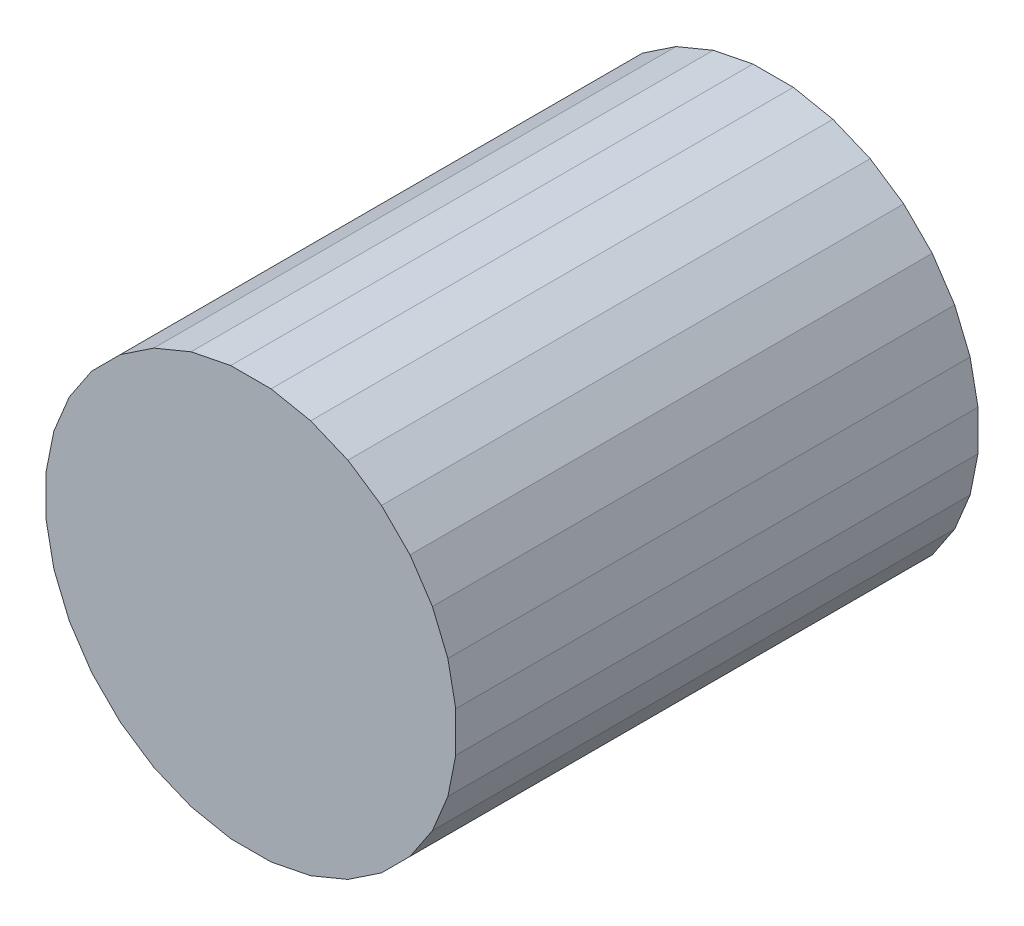
ISO-10303-21;
HEADER;
FILE_DESCRIPTION(('STEP AP214'),'2;1');
FILE_NAME('part.step','',(''),(''),'','','');
FILE_SCHEMA(('AUTOMOTIVE_DESIGN { 1 0 10303 214 1 1 1 1 }'));
ENDSEC;
DATA;
#1=APPLICATION_CONTEXT('core data for automotive mechanical design processes');
#2=APPLICATION_PROTOCOL_DEFINITION('international standard','automotive_design',2000,#1);
#3=PRODUCT_CONTEXT('',#1,'mechanical');
#4=PRODUCT('Part','Part','',(#3));
#5=PRODUCT_RELATED_PRODUCT_CATEGORY('part','',(#4));
#6=PRODUCT_DEFINITION_FORMATION('','',#4);
#7=PRODUCT_DEFINITION_CONTEXT('part definition',#1,'design');
#8=PRODUCT_DEFINITION('design','',#6,#7);
#9=PRODUCT_DEFINITION_SHAPE('','',#8);
#10=(LENGTH_UNIT() NAMED_UNIT(*) SI_UNIT(.MILLI.,.METRE.));
#11=(NAMED_UNIT(*) PLANE_ANGLE_UNIT() SI_UNIT($,.RADIAN.));
#12=(NAMED_UNIT(*) SI_UNIT($,.STERADIAN.) SOLID_ANGLE_UNIT());
#13=UNCERTAINTY_MEASURE_WITH_UNIT(LENGTH_MEASURE(1.E-05),#10,'distance_accuracy_value','');
#14=(GEOMETRIC_REPRESENTATION_CONTEXT(3) GLOBAL_UNCERTAINTY_ASSIGNED_CONTEXT((#13)) GLOBAL_UNIT_ASSIGNED_CONTEXT((#10,
#11,#12)) REPRESENTATION_CONTEXT('',''));
#15=CARTESIAN_POINT('',(0.,0.,0.));
#16=DIRECTION('',(0.,0.,1.));
#17=DIRECTION('',(1.,0.,0.));
#18=AXIS2_PLACEMENT_3D('',#15,#16,#17);
#19=CARTESIAN_POINT('',(-9.570444523572E-07,-9.570444537676E-07,3.94999972));
#20=DIRECTION('',(0.,0.,-1.));
#21=DIRECTION('',(0.,-1.,0.));
#22=AXIS2_PLACEMENT_3D('',#19,#20,#21);
#23=PLANE('',#22);
#24=DIRECTION('',(0.,-1.,0.));
#25=VECTOR('',#24,1.);
#26=CARTESIAN_POINT('',(1.54949144,0.,3.94999972));
#27=LINE('',#26,#25);
#28=CARTESIAN_POINT('',(1.54949144,0.15261082,3.94999972));
#29=VERTEX_POINT('',#28);
#30=CARTESIAN_POINT('',(1.54949144,-0.15261336,3.94999972));
#31=VERTEX_POINT('',#30);
#32=EDGE_CURVE('E540',#29,#31,#27,.T.);
#33=ORIENTED_EDGE('',*,*,#32,.F.);
#34=DIRECTION('',(0.195096606945041,-0.980784030232208,0.));
#35=VECTOR('',#34,1.);
#36=CARTESIAN_POINT('',(1.48994368,0.4519676,3.94999972));
#37=LINE('',#36,#35);
#38=CARTESIAN_POINT('',(1.48994368,0.4519676,3.94999972));
#39=VERTEX_POINT('',#38);
#40=EDGE_CURVE('E176',#39,#29,#37,.T.);
#41=ORIENTED_EDGE('',*,*,#40,.F.);
#42=DIRECTION('',(0.382683505564107,-0.923879502191258,0.));
#43=VECTOR('',#42,1.);
#44=CARTESIAN_POINT('',(1.37313924,0.7339584,3.94999972));
#45=LINE('',#44,#43);
#46=CARTESIAN_POINT('',(1.37313924,0.7339584,3.94999972));
#47=VERTEX_POINT('',#46);
#48=EDGE_CURVE('E179',#47,#39,#45,.T.);
#49=ORIENTED_EDGE('',*,*,#48,.F.);
#50=DIRECTION('',(0.555569838306281,-0.83146987604142,0.));
#51=VECTOR('',#50,1.);
#52=CARTESIAN_POINT('',(1.2035663,0.9877425,3.94999972));
#53=LINE('',#52,#51);
#54=CARTESIAN_POINT('',(1.2035663,0.9877425,3.94999972));
#55=VERTEX_POINT('',#54);
#56=EDGE_CURVE('E286',#55,#47,#53,.T.);
#57=ORIENTED_EDGE('',*,*,#56,.F.);
#58=DIRECTION('',(0.707106781186548,-0.707106781186548,0.));
#59=VECTOR('',#58,1.);
#60=CARTESIAN_POINT('',(0.9877425,1.2035663,3.94999972));
#61=LINE('',#60,#59);
#62=CARTESIAN_POINT('',(0.9877425,1.2035663,3.94999972));
#63=VERTEX_POINT('',#62);
#64=EDGE_CURVE('E424',#63,#55,#61,.T.);
#65=ORIENTED_EDGE('',*,*,#64,.F.);
#66=DIRECTION('',(0.831469876040958,-0.555569838306972,0.));
#67=VECTOR('',#66,1.);
#68=CARTESIAN_POINT('',(0.7339584,1.37313924,3.94999972));
#69=LINE('',#68,#67);
#70=CARTESIAN_POINT('',(0.7339584,1.37313924,3.94999972));
#71=VERTEX_POINT('',#70);
#72=EDGE_CURVE('E204',#71,#63,#69,.T.);
#73=ORIENTED_EDGE('',*,*,#72,.F.);
#74=DIRECTION('',(0.923879502191258,-0.382683505564107,0.));
#75=VECTOR('',#74,1.);
#76=CARTESIAN_POINT('',(0.4519676,1.48994368,3.94999972));
#77=LINE('',#76,#75);
#78=CARTESIAN_POINT('',(0.4519676,1.48994368,3.94999972));
#79=VERTEX_POINT('',#78);
#80=EDGE_CURVE('E189',#79,#71,#77,.T.);
#81=ORIENTED_EDGE('',*,*,#80,.F.);
#82=DIRECTION('',(0.980784030232208,-0.195096606945041,0.));
#83=VECTOR('',#82,1.);
#84=CARTESIAN_POINT('',(0.15261082,1.54949144,3.94999972));
#85=LINE('',#84,#83);
#86=CARTESIAN_POINT('',(0.15261082,1.54949144,3.94999972));
#87=VERTEX_POINT('',#86);
#88=EDGE_CURVE('E270',#87,#79,#85,.T.);
#89=ORIENTED_EDGE('',*,*,#88,.F.);
#90=DIRECTION('',(1.,0.,0.));
#91=VECTOR('',#90,1.);
#92=CARTESIAN_POINT('',(-0.15261336,1.54949144,3.94999972));
#93=LINE('',#92,#91);
#94=CARTESIAN_POINT('',(-0.15261336,1.54949144,3.94999972));
#95=VERTEX_POINT('',#94);
#96=EDGE_CURVE('E266',#95,#87,#93,.T.);
#97=ORIENTED_EDGE('',*,*,#96,.F.);
#98=DIRECTION('',(0.980784030232208,0.195096606945041,0.));
#99=VECTOR('',#98,1.);
#100=CARTESIAN_POINT('',(-0.45197014,1.48994368,3.94999972));
#101=LINE('',#100,#99);
#102=CARTESIAN_POINT('',(-0.45197014,1.48994368,3.94999972));
#103=VERTEX_POINT('',#102);
#104=EDGE_CURVE('E255',#103,#95,#101,.T.);
#105=ORIENTED_EDGE('',*,*,#104,.F.);
#106=DIRECTION('',(0.923879502191258,0.382683505564107,0.));
#107=VECTOR('',#106,1.);
#108=CARTESIAN_POINT('',(-0.73396094,1.37313924,3.94999972));
#109=LINE('',#108,#107);
#110=CARTESIAN_POINT('',(-0.73396094,1.37313924,3.94999972));
#111=VERTEX_POINT('',#110);
#112=EDGE_CURVE('E246',#111,#103,#109,.T.);
#113=ORIENTED_EDGE('',*,*,#112,.F.);
#114=DIRECTION('',(0.831469876040958,0.555569838306972,0.));
#115=VECTOR('',#114,1.);
#116=CARTESIAN_POINT('',(-0.98774504,1.2035663,3.94999972));
#117=LINE('',#116,#115);
#118=CARTESIAN_POINT('',(-0.98774504,1.2035663,3.94999972));
#119=VERTEX_POINT('',#118);
#120=EDGE_CURVE('E237',#119,#111,#117,.T.);
#121=ORIENTED_EDGE('',*,*,#120,.F.);
#122=DIRECTION('',(0.707106781186548,0.707106781186548,0.));
#123=VECTOR('',#122,1.);
#124=CARTESIAN_POINT('',(-1.20356884,0.9877425,3.94999972));
#125=LINE('',#124,#123);
#126=CARTESIAN_POINT('',(-1.20356884,0.9877425,3.94999972));
#127=VERTEX_POINT('',#126);
#128=EDGE_CURVE('E224',#127,#119,#125,.T.);
#129=ORIENTED_EDGE('',*,*,#128,.F.);
#130=DIRECTION('',(0.555569838306281,0.83146987604142,0.));
#131=VECTOR('',#130,1.);
#132=CARTESIAN_POINT('',(-1.37314178,0.7339584,3.94999972));
#133=LINE('',#132,#131);
#134=CARTESIAN_POINT('',(-1.37314178,0.7339584,3.94999972));
#135=VERTEX_POINT('',#134);
#136=EDGE_CURVE('E219',#135,#127,#133,.T.);
#137=ORIENTED_EDGE('',*,*,#136,.F.);
#138=DIRECTION('',(0.382683505564107,0.923879502191258,0.));
#139=VECTOR('',#138,1.);
#140=CARTESIAN_POINT('',(-1.48994622,0.4519676,3.94999972));
#141=LINE('',#140,#139);
#142=CARTESIAN_POINT('',(-1.48994622,0.4519676,3.94999972));
#143=VERTEX_POINT('',#142);
#144=EDGE_CURVE('E215',#143,#135,#141,.T.);
#145=ORIENTED_EDGE('',*,*,#144,.F.);
#146=DIRECTION('',(0.195088601863076,0.980785622561378,0.));
#147=VECTOR('',#146,1.);
#148=CARTESIAN_POINT('',(-1.54949144,0.15261082,3.94999972));
#149=LINE('',#148,#147);
#150=CARTESIAN_POINT('',(-1.54949144,0.15261082,3.94999972));
#151=VERTEX_POINT('',#150);
#152=EDGE_CURVE('E195',#151,#143,#149,.T.);
#153=ORIENTED_EDGE('',*,*,#152,.F.);
#154=DIRECTION('',(0.,1.,0.));
#155=VECTOR('',#154,1.);
#156=CARTESIAN_POINT('',(-1.54949144,-0.15261336,3.94999972));
#157=LINE('',#156,#155);
#158=CARTESIAN_POINT('',(-1.54949144,-0.15261336,3.94999972));
#159=VERTEX_POINT('',#158);
#160=EDGE_CURVE('E199',#159,#151,#157,.T.);
#161=ORIENTED_EDGE('',*,*,#160,.F.);
#162=DIRECTION('',(-0.195088601863076,0.980785622561378,0.));
#163=VECTOR('',#162,1.);
#164=CARTESIAN_POINT('',(-1.48994622,-0.45197014,3.94999972));
#165=LINE('',#164,#163);
#166=CARTESIAN_POINT('',(-1.48994622,-0.45197014,3.94999972));
#167=VERTEX_POINT('',#166);
#168=EDGE_CURVE('E352',#167,#159,#165,.T.);
#169=ORIENTED_EDGE('',*,*,#168,.F.);
#170=DIRECTION('',(-0.382683505564107,0.923879502191258,0.));
#171=VECTOR('',#170,1.);
#172=CARTESIAN_POINT('',(-1.37314178,-0.73396094,3.94999972));
#173=LINE('',#172,#171);
#174=CARTESIAN_POINT('',(-1.37314178,-0.73396094,3.94999972));
#175=VERTEX_POINT('',#174);
#176=EDGE_CURVE('E340',#175,#167,#173,.T.);
#177=ORIENTED_EDGE('',*,*,#176,.F.);
#178=DIRECTION('',(-0.555569838306281,0.83146987604142,0.));
#179=VECTOR('',#178,1.);
#180=CARTESIAN_POINT('',(-1.20356884,-0.98774504,3.94999972));
#181=LINE('',#180,#179);
#182=CARTESIAN_POINT('',(-1.20356884,-0.98774504,3.94999972));
#183=VERTEX_POINT('',#182);
#184=EDGE_CURVE('E323',#183,#175,#181,.T.);
#185=ORIENTED_EDGE('',*,*,#184,.F.);
#186=DIRECTION('',(-0.707106781186548,0.707106781186548,0.));
#187=VECTOR('',#186,1.);
#188=CARTESIAN_POINT('',(-0.98774504,-1.20356884,3.94999972));
#189=LINE('',#188,#187);
#190=CARTESIAN_POINT('',(-0.98774504,-1.20356884,3.94999972));
#191=VERTEX_POINT('',#190);
#192=EDGE_CURVE('E321',#191,#183,#189,.T.);
#193=ORIENTED_EDGE('',*,*,#192,.F.);
#194=DIRECTION('',(-0.831469876040958,0.555569838306972,0.));
#195=VECTOR('',#194,1.);
#196=CARTESIAN_POINT('',(-0.73396094,-1.37314178,3.94999972));
#197=LINE('',#196,#195);
#198=CARTESIAN_POINT('',(-0.73396094,-1.37314178,3.94999972));
#199=VERTEX_POINT('',#198);
#200=EDGE_CURVE('E455',#199,#191,#197,.T.);
#201=ORIENTED_EDGE('',*,*,#200,.F.);
#202=DIRECTION('',(-0.923879502191258,0.382683505564107,0.));
#203=VECTOR('',#202,1.);
#204=CARTESIAN_POINT('',(-0.45197014,-1.48994622,3.94999972));
#205=LINE('',#204,#203);
#206=CARTESIAN_POINT('',(-0.45197014,-1.48994622,3.94999972));
#207=VERTEX_POINT('',#206);
#208=EDGE_CURVE('E305',#207,#199,#205,.T.);
#209=ORIENTED_EDGE('',*,*,#208,.F.);
#210=DIRECTION('',(-0.980785622561608,0.195088601861922,0.));
#211=VECTOR('',#210,1.);
#212=CARTESIAN_POINT('',(-0.15261336,-1.54949144,3.94999972));
#213=LINE('',#212,#211);
#214=CARTESIAN_POINT('',(-0.15261336,-1.54949144,3.94999972));
#215=VERTEX_POINT('',#214);
#216=EDGE_CURVE('E500',#215,#207,#213,.T.);
#217=ORIENTED_EDGE('',*,*,#216,.F.);
#218=DIRECTION('',(-1.,0.,0.));
#219=VECTOR('',#218,1.);
#220=CARTESIAN_POINT('',(0.15261082,-1.54949144,3.94999972));
#221=LINE('',#220,#219);
#222=CARTESIAN_POINT('',(0.15261082,-1.54949144,3.94999972));
#223=VERTEX_POINT('',#222);
#224=EDGE_CURVE('E468',#223,#215,#221,.T.);
#225=ORIENTED_EDGE('',*,*,#224,.F.);
#226=DIRECTION('',(-0.980785622561608,-0.195088601861922,0.));
#227=VECTOR('',#226,1.);
#228=CARTESIAN_POINT('',(0.4519676,-1.48994622,3.94999972));
#229=LINE('',#228,#227);
#230=CARTESIAN_POINT('',(0.4519676,-1.48994622,3.94999972));
#231=VERTEX_POINT('',#230);
#232=EDGE_CURVE('E463',#231,#223,#229,.T.);
#233=ORIENTED_EDGE('',*,*,#232,.F.);
#234=DIRECTION('',(-0.923879502191258,-0.382683505564107,0.));
#235=VECTOR('',#234,1.);
#236=CARTESIAN_POINT('',(0.7339584,-1.37314178,3.94999972));
#237=LINE('',#236,#235);
#238=CARTESIAN_POINT('',(0.7339584,-1.37314178,3.94999972));
#239=VERTEX_POINT('',#238);
#240=EDGE_CURVE('E443',#239,#231,#237,.T.);
#241=ORIENTED_EDGE('',*,*,#240,.F.);
#242=DIRECTION('',(-0.831469876040958,-0.555569838306972,0.));
#243=VECTOR('',#242,1.);
#244=CARTESIAN_POINT('',(0.9877425,-1.20356884,3.94999972));
#245=LINE('',#244,#243);
#246=CARTESIAN_POINT('',(0.9877425,-1.20356884,3.94999972));
#247=VERTEX_POINT('',#246);
#248=EDGE_CURVE('E418',#247,#239,#245,.T.);
#249=ORIENTED_EDGE('',*,*,#248,.F.);
#250=DIRECTION('',(-0.707106781186548,-0.707106781186548,0.));
#251=VECTOR('',#250,1.);
#252=CARTESIAN_POINT('',(1.2035663,-0.98774504,3.94999972));
#253=LINE('',#252,#251);
#254=CARTESIAN_POINT('',(1.2035663,-0.98774504,3.94999972));
#255=VERTEX_POINT('',#254);
#256=EDGE_CURVE('E423',#255,#247,#253,.T.);
#257=ORIENTED_EDGE('',*,*,#256,.F.);
#258=DIRECTION('',(-0.555569838306281,-0.83146987604142,0.));
#259=VECTOR('',#258,1.);
#260=CARTESIAN_POINT('',(1.37313924,-0.73396094,3.94999972));
#261=LINE('',#260,#259);
#262=CARTESIAN_POINT('',(1.37313924,-0.73396094,3.94999972));
#263=VERTEX_POINT('',#262);
#264=EDGE_CURVE('E405',#263,#255,#261,.T.);
#265=ORIENTED_EDGE('',*,*,#264,.F.);
#266=DIRECTION('',(-0.382683505564107,-0.923879502191258,0.));
#267=VECTOR('',#266,1.);
#268=CARTESIAN_POINT('',(1.48994368,-0.45197014,3.94999972));
#269=LINE('',#268,#267);
#270=CARTESIAN_POINT('',(1.48994368,-0.45197014,3.94999972));
#271=VERTEX_POINT('',#270);
#272=EDGE_CURVE('E383',#271,#263,#269,.T.);
#273=ORIENTED_EDGE('',*,*,#272,.F.);
#274=DIRECTION('',(-0.195096606945041,-0.980784030232208,0.));
#275=VECTOR('',#274,1.);
#276=CARTESIAN_POINT('',(1.54949144,-0.15261336,3.94999972));
#277=LINE('',#276,#275);
#278=EDGE_CURVE('E386',#31,#271,#277,.T.);
#279=ORIENTED_EDGE('',*,*,#278,.F.);
#280=EDGE_LOOP('',(#33,#41,#49,#57,#65,#73,#81,#89,#97,#105,#113,#121,#129,#137,#145,#153,#161,
#169,#177,#185,#193,#201,#209,#217,#225,#233,#241,#249,#257,#265,#273,#279));
#281=FACE_BOUND('',#280,.T.);
#282=ADVANCED_FACE('F17',(#281),#23,.F.);
#283=CARTESIAN_POINT('',(-9.570444523572E-07,-9.570444537676E-07,0.));
#284=DIRECTION('',(0.,0.,-1.));
#285=DIRECTION('',(0.,-1.,0.));
#286=AXIS2_PLACEMENT_3D('',#283,#284,#285);
#287=PLANE('',#286);
#288=DIRECTION('',(0.,-1.,0.));
#289=VECTOR('',#288,1.);
#290=CARTESIAN_POINT('',(1.54949144,0.,0.));
#291=LINE('',#290,#289);
#292=CARTESIAN_POINT('',(1.54949144,0.15261082,0.));
#293=VERTEX_POINT('',#292);
#294=CARTESIAN_POINT('',(1.54949144,-0.15261336,0.));
#295=VERTEX_POINT('',#294);
#296=EDGE_CURVE('E40',#293,#295,#291,.T.);
#297=ORIENTED_EDGE('',*,*,#296,.T.);
#298=DIRECTION('',(-0.195096606945041,-0.980784030232208,0.));
#299=VECTOR('',#298,1.);
#300=CARTESIAN_POINT('',(1.54949144,-0.15261336,0.));
#301=LINE('',#300,#299);
#302=CARTESIAN_POINT('',(1.48994368,-0.45197014,0.));
#303=VERTEX_POINT('',#302);
#304=EDGE_CURVE('E398',#295,#303,#301,.T.);
#305=ORIENTED_EDGE('',*,*,#304,.T.);
#306=DIRECTION('',(-0.382683505564107,-0.923879502191258,0.));
#307=VECTOR('',#306,1.);
#308=CARTESIAN_POINT('',(1.48994368,-0.45197014,0.));
#309=LINE('',#308,#307);
#310=CARTESIAN_POINT('',(1.37313924,-0.73396094,0.));
#311=VERTEX_POINT('',#310);
#312=EDGE_CURVE('E382',#303,#311,#309,.T.);
#313=ORIENTED_EDGE('',*,*,#312,.T.);
#314=DIRECTION('',(-0.555569838306281,-0.83146987604142,0.));
#315=VECTOR('',#314,1.);
#316=CARTESIAN_POINT('',(1.37313924,-0.73396094,0.));
#317=LINE('',#316,#315);
#318=CARTESIAN_POINT('',(1.2035663,-0.98774504,0.));
#319=VERTEX_POINT('',#318);
#320=EDGE_CURVE('E413',#311,#319,#317,.T.);
#321=ORIENTED_EDGE('',*,*,#320,.T.);
#322=DIRECTION('',(-0.707106781186548,-0.707106781186548,0.));
#323=VECTOR('',#322,1.);
#324=CARTESIAN_POINT('',(1.2035663,-0.98774504,0.));
#325=LINE('',#324,#323);
#326=CARTESIAN_POINT('',(0.9877425,-1.20356884,0.));
#327=VERTEX_POINT('',#326);
#328=EDGE_CURVE('E414',#319,#327,#325,.T.);
#329=ORIENTED_EDGE('',*,*,#328,.T.);
#330=DIRECTION('',(-0.831469876040958,-0.555569838306972,0.));
#331=VECTOR('',#330,1.);
#332=CARTESIAN_POINT('',(0.9877425,-1.20356884,0.));
#333=LINE('',#332,#331);
#334=CARTESIAN_POINT('',(0.7339584,-1.37314178,0.));
#335=VERTEX_POINT('',#334);
#336=EDGE_CURVE('E439',#327,#335,#333,.T.);
#337=ORIENTED_EDGE('',*,*,#336,.T.);
#338=DIRECTION('',(-0.923879502191258,-0.382683505564107,0.));
#339=VECTOR('',#338,1.);
#340=CARTESIAN_POINT('',(0.7339584,-1.37314178,0.));
#341=LINE('',#340,#339);
#342=CARTESIAN_POINT('',(0.4519676,-1.48994622,0.));
#343=VERTEX_POINT('',#342);
#344=EDGE_CURVE('E454',#335,#343,#341,.T.);
#345=ORIENTED_EDGE('',*,*,#344,.T.);
#346=DIRECTION('',(-0.980785622561608,-0.195088601861922,0.));
#347=VECTOR('',#346,1.);
#348=CARTESIAN_POINT('',(0.4519676,-1.48994622,0.));
#349=LINE('',#348,#347);
#350=CARTESIAN_POINT('',(0.15261082,-1.54949144,0.));
#351=VERTEX_POINT('',#350);
#352=EDGE_CURVE('E476',#343,#351,#349,.T.);
#353=ORIENTED_EDGE('',*,*,#352,.T.);
#354=DIRECTION('',(-1.,0.,0.));
#355=VECTOR('',#354,1.);
#356=CARTESIAN_POINT('',(0.15261082,-1.54949144,0.));
#357=LINE('',#356,#355);
#358=CARTESIAN_POINT('',(-0.15261336,-1.54949144,0.));
#359=VERTEX_POINT('',#358);
#360=EDGE_CURVE('E464',#351,#359,#357,.T.);
#361=ORIENTED_EDGE('',*,*,#360,.T.);
#362=DIRECTION('',(-0.980785622561608,0.195088601861922,0.));
#363=VECTOR('',#362,1.);
#364=CARTESIAN_POINT('',(-0.15261336,-1.54949144,0.));
#365=LINE('',#364,#363);
#366=CARTESIAN_POINT('',(-0.45197014,-1.48994622,0.));
#367=VERTEX_POINT('',#366);
#368=EDGE_CURVE('E300',#359,#367,#365,.T.);
#369=ORIENTED_EDGE('',*,*,#368,.T.);
#370=DIRECTION('',(-0.923879502191258,0.382683505564107,0.));
#371=VECTOR('',#370,1.);
#372=CARTESIAN_POINT('',(-0.45197014,-1.48994622,0.));
#373=LINE('',#372,#371);
#374=CARTESIAN_POINT('',(-0.73396094,-1.37314178,0.));
#375=VERTEX_POINT('',#374);
#376=EDGE_CURVE('E459',#367,#375,#373,.T.);
#377=ORIENTED_EDGE('',*,*,#376,.T.);
#378=DIRECTION('',(-0.831469876040958,0.555569838306972,0.));
#379=VECTOR('',#378,1.);
#380=CARTESIAN_POINT('',(-0.73396094,-1.37314178,0.));
#381=LINE('',#380,#379);
#382=CARTESIAN_POINT('',(-0.98774504,-1.20356884,0.));
#383=VERTEX_POINT('',#382);
#384=EDGE_CURVE('E317',#375,#383,#381,.T.);
#385=ORIENTED_EDGE('',*,*,#384,.T.);
#386=DIRECTION('',(-0.707106781186548,0.707106781186548,0.));
#387=VECTOR('',#386,1.);
#388=CARTESIAN_POINT('',(-0.98774504,-1.20356884,0.));
#389=LINE('',#388,#387);
#390=CARTESIAN_POINT('',(-1.20356884,-0.98774504,0.));
#391=VERTEX_POINT('',#390);
#392=EDGE_CURVE('E328',#383,#391,#389,.T.);
#393=ORIENTED_EDGE('',*,*,#392,.T.);
#394=DIRECTION('',(-0.555569838306281,0.83146987604142,0.));
#395=VECTOR('',#394,1.);
#396=CARTESIAN_POINT('',(-1.20356884,-0.98774504,0.));
#397=LINE('',#396,#395);
#398=CARTESIAN_POINT('',(-1.37314178,-0.73396094,0.));
#399=VERTEX_POINT('',#398);
#400=EDGE_CURVE('E331',#391,#399,#397,.T.);
#401=ORIENTED_EDGE('',*,*,#400,.T.);
#402=DIRECTION('',(-0.382683505564107,0.923879502191258,0.));
#403=VECTOR('',#402,1.);
#404=CARTESIAN_POINT('',(-1.37314178,-0.73396094,0.));
#405=LINE('',#404,#403);
#406=CARTESIAN_POINT('',(-1.48994622,-0.45197014,0.));
#407=VERTEX_POINT('',#406);
#408=EDGE_CURVE('E345',#399,#407,#405,.T.);
#409=ORIENTED_EDGE('',*,*,#408,.T.);
#410=DIRECTION('',(-0.195088601863076,0.980785622561378,0.));
#411=VECTOR('',#410,1.);
#412=CARTESIAN_POINT('',(-1.48994622,-0.45197014,0.));
#413=LINE('',#412,#411);
#414=CARTESIAN_POINT('',(-1.54949144,-0.15261336,0.));
#415=VERTEX_POINT('',#414);
#416=EDGE_CURVE('E358',#407,#415,#413,.T.);
#417=ORIENTED_EDGE('',*,*,#416,.T.);
#418=DIRECTION('',(0.,1.,0.));
#419=VECTOR('',#418,1.);
#420=CARTESIAN_POINT('',(-1.54949144,-0.15261336,0.));
#421=LINE('',#420,#419);
#422=CARTESIAN_POINT('',(-1.54949144,0.15261082,0.));
#423=VERTEX_POINT('',#422);
#424=EDGE_CURVE('E196',#415,#423,#421,.T.);
#425=ORIENTED_EDGE('',*,*,#424,.T.);
#426=DIRECTION('',(0.195088601863076,0.980785622561378,0.));
#427=VECTOR('',#426,1.);
#428=CARTESIAN_POINT('',(-1.54949144,0.15261082,0.));
#429=LINE('',#428,#427);
#430=CARTESIAN_POINT('',(-1.48994622,0.4519676,0.));
#431=VERTEX_POINT('',#430);
#432=EDGE_CURVE('E336',#423,#431,#429,.T.);
#433=ORIENTED_EDGE('',*,*,#432,.T.);
#434=DIRECTION('',(0.382683505564107,0.923879502191258,0.));
#435=VECTOR('',#434,1.);
#436=CARTESIAN_POINT('',(-1.48994622,0.4519676,0.));
#437=LINE('',#436,#435);
#438=CARTESIAN_POINT('',(-1.37314178,0.7339584,0.));
#439=VERTEX_POINT('',#438);
#440=EDGE_CURVE('E214',#431,#439,#437,.T.);
#441=ORIENTED_EDGE('',*,*,#440,.T.);
#442=DIRECTION('',(0.555569838306281,0.83146987604142,0.));
#443=VECTOR('',#442,1.);
#444=CARTESIAN_POINT('',(-1.37314178,0.7339584,0.));
#445=LINE('',#444,#443);
#446=CARTESIAN_POINT('',(-1.20356884,0.9877425,0.));
#447=VERTEX_POINT('',#446);
#448=EDGE_CURVE('E229',#439,#447,#445,.T.);
#449=ORIENTED_EDGE('',*,*,#448,.T.);
#450=DIRECTION('',(0.707106781186548,0.707106781186548,0.));
#451=VECTOR('',#450,1.);
#452=CARTESIAN_POINT('',(-1.20356884,0.9877425,0.));
#453=LINE('',#452,#451);
#454=CARTESIAN_POINT('',(-0.98774504,1.2035663,0.));
#455=VERTEX_POINT('',#454);
#456=EDGE_CURVE('E233',#447,#455,#453,.T.);
#457=ORIENTED_EDGE('',*,*,#456,.T.);
#458=DIRECTION('',(0.831469876040958,0.555569838306972,0.));
#459=VECTOR('',#458,1.);
#460=CARTESIAN_POINT('',(-0.98774504,1.2035663,0.));
#461=LINE('',#460,#459);
#462=CARTESIAN_POINT('',(-0.73396094,1.37313924,0.));
#463=VERTEX_POINT('',#462);
#464=EDGE_CURVE('E242',#455,#463,#461,.T.);
#465=ORIENTED_EDGE('',*,*,#464,.T.);
#466=DIRECTION('',(0.923879502191258,0.382683505564107,0.));
#467=VECTOR('',#466,1.);
#468=CARTESIAN_POINT('',(-0.73396094,1.37313924,0.));
#469=LINE('',#468,#467);
#470=CARTESIAN_POINT('',(-0.45197014,1.48994368,0.));
#471=VERTEX_POINT('',#470);
#472=EDGE_CURVE('E254',#463,#471,#469,.T.);
#473=ORIENTED_EDGE('',*,*,#472,.T.);
#474=DIRECTION('',(0.980784030232208,0.195096606945041,0.));
#475=VECTOR('',#474,1.);
#476=CARTESIAN_POINT('',(-0.45197014,1.48994368,0.));
#477=LINE('',#476,#475);
#478=CARTESIAN_POINT('',(-0.15261336,1.54949144,0.));
#479=VERTEX_POINT('',#478);
#480=EDGE_CURVE('E262',#471,#479,#477,.T.);
#481=ORIENTED_EDGE('',*,*,#480,.T.);
#482=DIRECTION('',(1.,0.,0.));
#483=VECTOR('',#482,1.);
#484=CARTESIAN_POINT('',(-0.15261336,1.54949144,0.));
#485=LINE('',#484,#483);
#486=CARTESIAN_POINT('',(0.15261082,1.54949144,0.));
#487=VERTEX_POINT('',#486);
#488=EDGE_CURVE('E269',#479,#487,#485,.T.);
#489=ORIENTED_EDGE('',*,*,#488,.T.);
#490=DIRECTION('',(0.980784030232208,-0.195096606945041,0.));
#491=VECTOR('',#490,1.);
#492=CARTESIAN_POINT('',(0.15261082,1.54949144,0.));
#493=LINE('',#492,#491);
#494=CARTESIAN_POINT('',(0.4519676,1.48994368,0.));
#495=VERTEX_POINT('',#494);
#496=EDGE_CURVE('E279',#487,#495,#493,.T.);
#497=ORIENTED_EDGE('',*,*,#496,.T.);
#498=DIRECTION('',(0.923879502191258,-0.382683505564107,0.));
#499=VECTOR('',#498,1.);
#500=CARTESIAN_POINT('',(0.4519676,1.48994368,0.));
#501=LINE('',#500,#499);
#502=CARTESIAN_POINT('',(0.7339584,1.37313924,0.));
#503=VERTEX_POINT('',#502);
#504=EDGE_CURVE('E200',#495,#503,#501,.T.);
#505=ORIENTED_EDGE('',*,*,#504,.T.);
#506=DIRECTION('',(0.831469876040958,-0.555569838306972,0.));
#507=VECTOR('',#506,1.);
#508=CARTESIAN_POINT('',(0.7339584,1.37313924,0.));
#509=LINE('',#508,#507);
#510=CARTESIAN_POINT('',(0.9877425,1.2035663,0.));
#511=VERTEX_POINT('',#510);
#512=EDGE_CURVE('E428',#503,#511,#509,.T.);
#513=ORIENTED_EDGE('',*,*,#512,.T.);
#514=DIRECTION('',(0.707106781186548,-0.707106781186548,0.));
#515=VECTOR('',#514,1.);
#516=CARTESIAN_POINT('',(0.9877425,1.2035663,0.));
#517=LINE('',#516,#515);
#518=CARTESIAN_POINT('',(1.2035663,0.9877425,0.));
#519=VERTEX_POINT('',#518);
#520=EDGE_CURVE('E283',#511,#519,#517,.T.);
#521=ORIENTED_EDGE('',*,*,#520,.T.);
#522=DIRECTION('',(0.555569838306281,-0.83146987604142,0.));
#523=VECTOR('',#522,1.);
#524=CARTESIAN_POINT('',(1.2035663,0.9877425,0.));
#525=LINE('',#524,#523);
#526=CARTESIAN_POINT('',(1.37313924,0.7339584,0.));
#527=VERTEX_POINT('',#526);
#528=EDGE_CURVE('E171',#519,#527,#525,.T.);
#529=ORIENTED_EDGE('',*,*,#528,.T.);
#530=DIRECTION('',(0.382683505564107,-0.923879502191258,0.));
#531=VECTOR('',#530,1.);
#532=CARTESIAN_POINT('',(1.37313924,0.7339584,0.));
#533=LINE('',#532,#531);
#534=CARTESIAN_POINT('',(1.48994368,0.4519676,0.));
#535=VERTEX_POINT('',#534);
#536=EDGE_CURVE('E169',#527,#535,#533,.T.);
#537=ORIENTED_EDGE('',*,*,#536,.T.);
#538=DIRECTION('',(0.195096606945041,-0.980784030232208,0.));
#539=VECTOR('',#538,1.);
#540=CARTESIAN_POINT('',(1.48994368,0.4519676,0.));
#541=LINE('',#540,#539);
#542=EDGE_CURVE('E11',#535,#293,#541,.T.);
#543=ORIENTED_EDGE('',*,*,#542,.T.);
#544=EDGE_LOOP('',(#297,#305,#313,#321,#329,#337,#345,#353,#361,#369,#377,#385,#393,#401,#409,
#417,#425,#433,#441,#449,#457,#465,#473,#481,#489,#497,#505,#513,#521,#529,#537,#543));
#545=FACE_BOUND('',#544,.T.);
#546=ADVANCED_FACE('F19',(#545),#287,.T.);
#547=CARTESIAN_POINT('',(1.48994368,0.4519676,0.));
#548=DIRECTION('',(0.980784030232208,0.195096606945041,0.));
#549=DIRECTION('',(0.,0.,-1.));
#550=AXIS2_PLACEMENT_3D('',#547,#548,#549);
#551=PLANE('',#550);
#552=DIRECTION('',(0.,0.,1.));
#553=VECTOR('',#552,1.);
#554=CARTESIAN_POINT('',(1.48994368,0.4519676,0.));
#555=LINE('',#554,#553);
#556=EDGE_CURVE('E165',#535,#39,#555,.T.);
#557=ORIENTED_EDGE('',*,*,#556,.T.);
#558=ORIENTED_EDGE('',*,*,#40,.T.);
#559=DIRECTION('',(0.,0.,1.));
#560=VECTOR('',#559,1.);
#561=CARTESIAN_POINT('',(1.54949144,0.15261082,0.));
#562=LINE('',#561,#560);
#563=EDGE_CURVE('E21',#293,#29,#562,.T.);
#564=ORIENTED_EDGE('',*,*,#563,.F.);
#565=ORIENTED_EDGE('',*,*,#542,.F.);
#566=EDGE_LOOP('',(#557,#558,#564,#565));
#567=FACE_BOUND('',#566,.T.);
#568=ADVANCED_FACE('F162',(#567),#551,.T.);
#569=CARTESIAN_POINT('',(1.37313924,0.7339584,0.));
#570=DIRECTION('',(0.923879502191258,0.382683505564107,0.));
#571=DIRECTION('',(0.,0.,-1.));
#572=AXIS2_PLACEMENT_3D('',#569,#570,#571);
#573=PLANE('',#572);
#574=DIRECTION('',(0.,0.,1.));
#575=VECTOR('',#574,1.);
#576=CARTESIAN_POINT('',(1.37313924,0.7339584,0.));
#577=LINE('',#576,#575);
#578=EDGE_CURVE('E290',#527,#47,#577,.T.);
#579=ORIENTED_EDGE('',*,*,#578,.T.);
#580=ORIENTED_EDGE('',*,*,#48,.T.);
#581=ORIENTED_EDGE('',*,*,#556,.F.);
#582=ORIENTED_EDGE('',*,*,#536,.F.);
#583=EDGE_LOOP('',(#579,#580,#581,#582));
#584=FACE_BOUND('',#583,.T.);
#585=ADVANCED_FACE('F178',(#584),#573,.T.);
#586=CARTESIAN_POINT('',(1.2035663,0.9877425,0.));
#587=DIRECTION('',(0.83146987604142,0.555569838306281,0.));
#588=DIRECTION('',(0.,0.,-1.));
#589=AXIS2_PLACEMENT_3D('',#586,#587,#588);
#590=PLANE('',#589);
#591=DIRECTION('',(0.,0.,1.));
#592=VECTOR('',#591,1.);
#593=CARTESIAN_POINT('',(1.2035663,0.9877425,0.));
#594=LINE('',#593,#592);
#595=EDGE_CURVE('E287',#519,#55,#594,.T.);
#596=ORIENTED_EDGE('',*,*,#595,.T.);
#597=ORIENTED_EDGE('',*,*,#56,.T.);
#598=ORIENTED_EDGE('',*,*,#578,.F.);
#599=ORIENTED_EDGE('',*,*,#528,.F.);
#600=EDGE_LOOP('',(#596,#597,#598,#599));
#601=FACE_BOUND('',#600,.T.);
#602=ADVANCED_FACE('F755',(#601),#590,.T.);
#603=CARTESIAN_POINT('',(0.9877425,1.2035663,0.));
#604=DIRECTION('',(0.707106781186548,0.707106781186548,0.));
#605=DIRECTION('',(0.,0.,-1.));
#606=AXIS2_PLACEMENT_3D('',#603,#604,#605);
#607=PLANE('',#606);
#608=DIRECTION('',(0.,0.,1.));
#609=VECTOR('',#608,1.);
#610=CARTESIAN_POINT('',(0.9877425,1.2035663,0.));
#611=LINE('',#610,#609);
#612=EDGE_CURVE('E313',#511,#63,#611,.T.);
#613=ORIENTED_EDGE('',*,*,#612,.T.);
#614=ORIENTED_EDGE('',*,*,#64,.T.);
#615=ORIENTED_EDGE('',*,*,#595,.F.);
#616=ORIENTED_EDGE('',*,*,#520,.F.);
#617=EDGE_LOOP('',(#613,#614,#615,#616));
#618=FACE_BOUND('',#617,.T.);
#619=ADVANCED_FACE('F763',(#618),#607,.T.);
#620=CARTESIAN_POINT('',(0.7339584,1.37313924,0.));
#621=DIRECTION('',(0.555569838306972,0.831469876040958,0.));
#622=DIRECTION('',(0.,0.,-1.));
#623=AXIS2_PLACEMENT_3D('',#620,#621,#622);
#624=PLANE('',#623);
#625=DIRECTION('',(0.,0.,1.));
#626=VECTOR('',#625,1.);
#627=CARTESIAN_POINT('',(0.7339584,1.37313924,0.));
#628=LINE('',#627,#626);
#629=EDGE_CURVE('E205',#503,#71,#628,.T.);
#630=ORIENTED_EDGE('',*,*,#629,.T.);
#631=ORIENTED_EDGE('',*,*,#72,.T.);
#632=ORIENTED_EDGE('',*,*,#612,.F.);
#633=ORIENTED_EDGE('',*,*,#512,.F.);
#634=EDGE_LOOP('',(#630,#631,#632,#633));
#635=FACE_BOUND('',#634,.T.);
#636=ADVANCED_FACE('F772',(#635),#624,.T.);
#637=CARTESIAN_POINT('',(0.4519676,1.48994368,0.));
#638=DIRECTION('',(0.382683505564107,0.923879502191258,0.));
#639=DIRECTION('',(0.,0.,-1.));
#640=AXIS2_PLACEMENT_3D('',#637,#638,#639);
#641=PLANE('',#640);
#642=DIRECTION('',(0.,0.,1.));
#643=VECTOR('',#642,1.);
#644=CARTESIAN_POINT('',(0.4519676,1.48994368,0.));
#645=LINE('',#644,#643);
#646=EDGE_CURVE('E274',#495,#79,#645,.T.);
#647=ORIENTED_EDGE('',*,*,#646,.T.);
#648=ORIENTED_EDGE('',*,*,#80,.T.);
#649=ORIENTED_EDGE('',*,*,#629,.F.);
#650=ORIENTED_EDGE('',*,*,#504,.F.);
#651=EDGE_LOOP('',(#647,#648,#649,#650));
#652=FACE_BOUND('',#651,.T.);
#653=ADVANCED_FACE('F781',(#652),#641,.T.);
#654=CARTESIAN_POINT('',(0.15261082,1.54949144,0.));
#655=DIRECTION('',(0.195096606945041,0.980784030232208,0.));
#656=DIRECTION('',(0.,0.,-1.));
#657=AXIS2_PLACEMENT_3D('',#654,#655,#656);
#658=PLANE('',#657);
#659=DIRECTION('',(0.,0.,1.));
#660=VECTOR('',#659,1.);
#661=CARTESIAN_POINT('',(0.15261082,1.54949144,0.));
#662=LINE('',#661,#660);
#663=EDGE_CURVE('E275',#487,#87,#662,.T.);
#664=ORIENTED_EDGE('',*,*,#663,.T.);
#665=ORIENTED_EDGE('',*,*,#88,.T.);
#666=ORIENTED_EDGE('',*,*,#646,.F.);
#667=ORIENTED_EDGE('',*,*,#496,.F.);
#668=EDGE_LOOP('',(#664,#665,#666,#667));
#669=FACE_BOUND('',#668,.T.);
#670=ADVANCED_FACE('F790',(#669),#658,.T.);
#671=CARTESIAN_POINT('',(-0.15261336,1.54949144,0.));
#672=DIRECTION('',(0.,1.,0.));
#673=DIRECTION('',(1.,0.,0.));
#674=AXIS2_PLACEMENT_3D('',#671,#672,#673);
#675=PLANE('',#674);
#676=DIRECTION('',(0.,0.,1.));
#677=VECTOR('',#676,1.);
#678=CARTESIAN_POINT('',(-0.15261336,1.54949144,0.));
#679=LINE('',#678,#677);
#680=EDGE_CURVE('E259',#479,#95,#679,.T.);
#681=ORIENTED_EDGE('',*,*,#680,.T.);
#682=ORIENTED_EDGE('',*,*,#96,.T.);
#683=ORIENTED_EDGE('',*,*,#663,.F.);
#684=ORIENTED_EDGE('',*,*,#488,.F.);
#685=EDGE_LOOP('',(#681,#682,#683,#684));
#686=FACE_BOUND('',#685,.T.);
#687=ADVANCED_FACE('F799',(#686),#675,.T.);
#688=CARTESIAN_POINT('',(-0.45197014,1.48994368,0.));
#689=DIRECTION('',(-0.195096606945041,0.980784030232208,0.));
#690=DIRECTION('',(0.,0.,1.));
#691=AXIS2_PLACEMENT_3D('',#688,#689,#690);
#692=PLANE('',#691);
#693=DIRECTION('',(0.,0.,1.));
#694=VECTOR('',#693,1.);
#695=CARTESIAN_POINT('',(-0.45197014,1.48994368,0.));
#696=LINE('',#695,#694);
#697=EDGE_CURVE('E249',#471,#103,#696,.T.);
#698=ORIENTED_EDGE('',*,*,#697,.T.);
#699=ORIENTED_EDGE('',*,*,#104,.T.);
#700=ORIENTED_EDGE('',*,*,#680,.F.);
#701=ORIENTED_EDGE('',*,*,#480,.F.);
#702=EDGE_LOOP('',(#698,#699,#700,#701));
#703=FACE_BOUND('',#702,.T.);
#704=ADVANCED_FACE('F808',(#703),#692,.T.);
#705=CARTESIAN_POINT('',(-0.73396094,1.37313924,0.));
#706=DIRECTION('',(-0.382683505564107,0.923879502191258,0.));
#707=DIRECTION('',(0.,0.,1.));
#708=AXIS2_PLACEMENT_3D('',#705,#706,#707);
#709=PLANE('',#708);
#710=DIRECTION('',(0.,0.,1.));
#711=VECTOR('',#710,1.);
#712=CARTESIAN_POINT('',(-0.73396094,1.37313924,0.));
#713=LINE('',#712,#711);
#714=EDGE_CURVE('E241',#463,#111,#713,.T.);
#715=ORIENTED_EDGE('',*,*,#714,.T.);
#716=ORIENTED_EDGE('',*,*,#112,.T.);
#717=ORIENTED_EDGE('',*,*,#697,.F.);
#718=ORIENTED_EDGE('',*,*,#472,.F.);
#719=EDGE_LOOP('',(#715,#716,#717,#718));
#720=FACE_BOUND('',#719,.T.);
#721=ADVANCED_FACE('F817',(#720),#709,.T.);
#722=CARTESIAN_POINT('',(-0.98774504,1.2035663,0.));
#723=DIRECTION('',(-0.555569838306972,0.831469876040958,0.));
#724=DIRECTION('',(0.,0.,1.));
#725=AXIS2_PLACEMENT_3D('',#722,#723,#724);
#726=PLANE('',#725);
#727=DIRECTION('',(0.,0.,1.));
#728=VECTOR('',#727,1.);
#729=CARTESIAN_POINT('',(-0.98774504,1.2035663,0.));
#730=LINE('',#729,#728);
#731=EDGE_CURVE('E228',#455,#119,#730,.T.);
#732=ORIENTED_EDGE('',*,*,#731,.T.);
#733=ORIENTED_EDGE('',*,*,#120,.T.);
#734=ORIENTED_EDGE('',*,*,#714,.F.);
#735=ORIENTED_EDGE('',*,*,#464,.F.);
#736=EDGE_LOOP('',(#732,#733,#734,#735));
#737=FACE_BOUND('',#736,.T.);
#738=ADVANCED_FACE('F826',(#737),#726,.T.);
#739=CARTESIAN_POINT('',(-1.20356884,0.9877425,0.));
#740=DIRECTION('',(-0.707106781186548,0.707106781186548,0.));
#741=DIRECTION('',(0.,0.,1.));
#742=AXIS2_PLACEMENT_3D('',#739,#740,#741);
#743=PLANE('',#742);
#744=DIRECTION('',(0.,0.,1.));
#745=VECTOR('',#744,1.);
#746=CARTESIAN_POINT('',(-1.20356884,0.9877425,0.));
#747=LINE('',#746,#745);
#748=EDGE_CURVE('E223',#447,#127,#747,.T.);
#749=ORIENTED_EDGE('',*,*,#748,.T.);
#750=ORIENTED_EDGE('',*,*,#128,.T.);
#751=ORIENTED_EDGE('',*,*,#731,.F.);
#752=ORIENTED_EDGE('',*,*,#456,.F.);
#753=EDGE_LOOP('',(#749,#750,#751,#752));
#754=FACE_BOUND('',#753,.T.);
#755=ADVANCED_FACE('F860',(#754),#743,.T.);
#756=CARTESIAN_POINT('',(-1.37314178,0.7339584,0.));
#757=DIRECTION('',(-0.83146987604142,0.555569838306281,0.));
#758=DIRECTION('',(0.,0.,1.));
#759=AXIS2_PLACEMENT_3D('',#756,#757,#758);
#760=PLANE('',#759);
#761=DIRECTION('',(0.,0.,1.));
#762=VECTOR('',#761,1.);
#763=CARTESIAN_POINT('',(-1.37314178,0.7339584,0.));
#764=LINE('',#763,#762);
#765=EDGE_CURVE('E210',#439,#135,#764,.T.);
#766=ORIENTED_EDGE('',*,*,#765,.T.);
#767=ORIENTED_EDGE('',*,*,#136,.T.);
#768=ORIENTED_EDGE('',*,*,#748,.F.);
#769=ORIENTED_EDGE('',*,*,#448,.F.);
#770=EDGE_LOOP('',(#766,#767,#768,#769));
#771=FACE_BOUND('',#770,.T.);
#772=ADVANCED_FACE('F838',(#771),#760,.T.);
#773=CARTESIAN_POINT('',(-1.48994622,0.4519676,0.));
#774=DIRECTION('',(-0.923879502191258,0.382683505564107,0.));
#775=DIRECTION('',(0.,0.,1.));
#776=AXIS2_PLACEMENT_3D('',#773,#774,#775);
#777=PLANE('',#776);
#778=DIRECTION('',(0.,0.,1.));
#779=VECTOR('',#778,1.);
#780=CARTESIAN_POINT('',(-1.48994622,0.4519676,0.));
#781=LINE('',#780,#779);
#782=EDGE_CURVE('E209',#431,#143,#781,.T.);
#783=ORIENTED_EDGE('',*,*,#782,.T.);
#784=ORIENTED_EDGE('',*,*,#144,.T.);
#785=ORIENTED_EDGE('',*,*,#765,.F.);
#786=ORIENTED_EDGE('',*,*,#440,.F.);
#787=EDGE_LOOP('',(#783,#784,#785,#786));
#788=FACE_BOUND('',#787,.T.);
#789=ADVANCED_FACE('F832',(#788),#777,.T.);
#790=CARTESIAN_POINT('',(-1.54949144,0.15261082,0.));
#791=DIRECTION('',(-0.980785622561378,0.195088601863076,0.));
#792=DIRECTION('',(0.,0.,1.));
#793=AXIS2_PLACEMENT_3D('',#790,#791,#792);
#794=PLANE('',#793);
#795=DIRECTION('',(0.,0.,1.));
#796=VECTOR('',#795,1.);
#797=CARTESIAN_POINT('',(-1.54949144,0.15261082,0.));
#798=LINE('',#797,#796);
#799=EDGE_CURVE('E191',#423,#151,#798,.T.);
#800=ORIENTED_EDGE('',*,*,#799,.T.);
#801=ORIENTED_EDGE('',*,*,#152,.T.);
#802=ORIENTED_EDGE('',*,*,#782,.F.);
#803=ORIENTED_EDGE('',*,*,#432,.F.);
#804=EDGE_LOOP('',(#800,#801,#802,#803));
#805=FACE_BOUND('',#804,.T.);
#806=ADVANCED_FACE('F837',(#805),#794,.T.);
#807=CARTESIAN_POINT('',(-1.54949144,-0.15261336,0.));
#808=DIRECTION('',(-1.,0.,0.));
#809=DIRECTION('',(0.,0.,1.));
#810=AXIS2_PLACEMENT_3D('',#807,#808,#809);
#811=PLANE('',#810);
#812=DIRECTION('',(0.,0.,1.));
#813=VECTOR('',#812,1.);
#814=CARTESIAN_POINT('',(-1.54949144,-0.15261336,0.));
#815=LINE('',#814,#813);
#816=EDGE_CURVE('E355',#415,#159,#815,.T.);
#817=ORIENTED_EDGE('',*,*,#816,.T.);
#818=ORIENTED_EDGE('',*,*,#160,.T.);
#819=ORIENTED_EDGE('',*,*,#799,.F.);
#820=ORIENTED_EDGE('',*,*,#424,.F.);
#821=EDGE_LOOP('',(#817,#818,#819,#820));
#822=FACE_BOUND('',#821,.T.);
#823=ADVANCED_FACE('F854',(#822),#811,.T.);
#824=CARTESIAN_POINT('',(-1.48994622,-0.45197014,0.));
#825=DIRECTION('',(-0.980785622561378,-0.195088601863076,0.));
#826=DIRECTION('',(-0.195088601863076,0.980785622561378,0.));
#827=AXIS2_PLACEMENT_3D('',#824,#825,#826);
#828=PLANE('',#827);
#829=DIRECTION('',(0.,0.,1.));
#830=VECTOR('',#829,1.);
#831=CARTESIAN_POINT('',(-1.48994622,-0.45197014,0.));
#832=LINE('',#831,#830);
#833=EDGE_CURVE('E341',#407,#167,#832,.T.);
#834=ORIENTED_EDGE('',*,*,#833,.T.);
#835=ORIENTED_EDGE('',*,*,#168,.T.);
#836=ORIENTED_EDGE('',*,*,#816,.F.);
#837=ORIENTED_EDGE('',*,*,#416,.F.);
#838=EDGE_LOOP('',(#834,#835,#836,#837));
#839=FACE_BOUND('',#838,.T.);
#840=ADVANCED_FACE('F694',(#839),#828,.T.);
#841=CARTESIAN_POINT('',(-1.37314178,-0.73396094,0.));
#842=DIRECTION('',(-0.923879502191258,-0.382683505564107,0.));
#843=DIRECTION('',(-0.382683505564107,0.923879502191258,0.));
#844=AXIS2_PLACEMENT_3D('',#841,#842,#843);
#845=PLANE('',#844);
#846=DIRECTION('',(0.,0.,1.));
#847=VECTOR('',#846,1.);
#848=CARTESIAN_POINT('',(-1.37314178,-0.73396094,0.));
#849=LINE('',#848,#847);
#850=EDGE_CURVE('E327',#399,#175,#849,.T.);
#851=ORIENTED_EDGE('',*,*,#850,.T.);
#852=ORIENTED_EDGE('',*,*,#176,.T.);
#853=ORIENTED_EDGE('',*,*,#833,.F.);
#854=ORIENTED_EDGE('',*,*,#408,.F.);
#855=EDGE_LOOP('',(#851,#852,#853,#854));
#856=FACE_BOUND('',#855,.T.);
#857=ADVANCED_FACE('F698',(#856),#845,.T.);
#858=CARTESIAN_POINT('',(-1.20356884,-0.98774504,0.));
#859=DIRECTION('',(-0.83146987604142,-0.555569838306281,0.));
#860=DIRECTION('',(-0.555569838306281,0.83146987604142,0.));
#861=AXIS2_PLACEMENT_3D('',#858,#859,#860);
#862=PLANE('',#861);
#863=DIRECTION('',(0.,0.,1.));
#864=VECTOR('',#863,1.);
#865=CARTESIAN_POINT('',(-1.20356884,-0.98774504,0.));
#866=LINE('',#865,#864);
#867=EDGE_CURVE('E394',#391,#183,#866,.T.);
#868=ORIENTED_EDGE('',*,*,#867,.T.);
#869=ORIENTED_EDGE('',*,*,#184,.T.);
#870=ORIENTED_EDGE('',*,*,#850,.F.);
#871=ORIENTED_EDGE('',*,*,#400,.F.);
#872=EDGE_LOOP('',(#868,#869,#870,#871));
#873=FACE_BOUND('',#872,.T.);
#874=ADVANCED_FACE('F701',(#873),#862,.T.);
#875=CARTESIAN_POINT('',(-0.98774504,-1.20356884,0.));
#876=DIRECTION('',(-0.707106781186548,-0.707106781186548,0.));
#877=DIRECTION('',(-0.707106781186548,0.707106781186548,0.));
#878=AXIS2_PLACEMENT_3D('',#875,#876,#877);
#879=PLANE('',#878);
#880=DIRECTION('',(0.,0.,1.));
#881=VECTOR('',#880,1.);
#882=CARTESIAN_POINT('',(-0.98774504,-1.20356884,0.));
#883=LINE('',#882,#881);
#884=EDGE_CURVE('E322',#383,#191,#883,.T.);
#885=ORIENTED_EDGE('',*,*,#884,.T.);
#886=ORIENTED_EDGE('',*,*,#192,.T.);
#887=ORIENTED_EDGE('',*,*,#867,.F.);
#888=ORIENTED_EDGE('',*,*,#392,.F.);
#889=EDGE_LOOP('',(#885,#886,#887,#888));
#890=FACE_BOUND('',#889,.T.);
#891=ADVANCED_FACE('F703',(#890),#879,.T.);
#892=CARTESIAN_POINT('',(-0.73396094,-1.37314178,0.));
#893=DIRECTION('',(-0.555569838306972,-0.831469876040958,0.));
#894=DIRECTION('',(-0.831469876040958,0.555569838306972,0.));
#895=AXIS2_PLACEMENT_3D('',#892,#893,#894);
#896=PLANE('',#895);
#897=DIRECTION('',(0.,0.,1.));
#898=VECTOR('',#897,1.);
#899=CARTESIAN_POINT('',(-0.73396094,-1.37314178,0.));
#900=LINE('',#899,#898);
#901=EDGE_CURVE('E309',#375,#199,#900,.T.);
#902=ORIENTED_EDGE('',*,*,#901,.T.);
#903=ORIENTED_EDGE('',*,*,#200,.T.);
#904=ORIENTED_EDGE('',*,*,#884,.F.);
#905=ORIENTED_EDGE('',*,*,#384,.F.);
#906=EDGE_LOOP('',(#902,#903,#904,#905));
#907=FACE_BOUND('',#906,.T.);
#908=ADVANCED_FACE('F705',(#907),#896,.T.);
#909=CARTESIAN_POINT('',(-0.45197014,-1.48994622,0.));
#910=DIRECTION('',(-0.382683505564107,-0.923879502191258,0.));
#911=DIRECTION('',(-0.923879502191258,0.382683505564107,0.));
#912=AXIS2_PLACEMENT_3D('',#909,#910,#911);
#913=PLANE('',#912);
#914=DIRECTION('',(0.,0.,1.));
#915=VECTOR('',#914,1.);
#916=CARTESIAN_POINT('',(-0.45197014,-1.48994622,0.));
#917=LINE('',#916,#915);
#918=EDGE_CURVE('E504',#367,#207,#917,.T.);
#919=ORIENTED_EDGE('',*,*,#918,.T.);
#920=ORIENTED_EDGE('',*,*,#208,.T.);
#921=ORIENTED_EDGE('',*,*,#901,.F.);
#922=ORIENTED_EDGE('',*,*,#376,.F.);
#923=EDGE_LOOP('',(#919,#920,#921,#922));
#924=FACE_BOUND('',#923,.T.);
#925=ADVANCED_FACE('F709',(#924),#913,.T.);
#926=CARTESIAN_POINT('',(-0.15261336,-1.54949144,0.));
#927=DIRECTION('',(-0.195088601861922,-0.980785622561608,0.));
#928=DIRECTION('',(-0.980785622561608,0.195088601861922,0.));
#929=AXIS2_PLACEMENT_3D('',#926,#927,#928);
#930=PLANE('',#929);
#931=DIRECTION('',(0.,0.,1.));
#932=VECTOR('',#931,1.);
#933=CARTESIAN_POINT('',(-0.15261336,-1.54949144,0.));
#934=LINE('',#933,#932);
#935=EDGE_CURVE('E467',#359,#215,#934,.T.);
#936=ORIENTED_EDGE('',*,*,#935,.T.);
#937=ORIENTED_EDGE('',*,*,#216,.T.);
#938=ORIENTED_EDGE('',*,*,#918,.F.);
#939=ORIENTED_EDGE('',*,*,#368,.F.);
#940=EDGE_LOOP('',(#936,#937,#938,#939));
#941=FACE_BOUND('',#940,.T.);
#942=ADVANCED_FACE('F712',(#941),#930,.T.);
#943=CARTESIAN_POINT('',(0.15261082,-1.54949144,0.));
#944=DIRECTION('',(0.,-1.,0.));
#945=DIRECTION('',(0.,0.,-1.));
#946=AXIS2_PLACEMENT_3D('',#943,#944,#945);
#947=PLANE('',#946);
#948=DIRECTION('',(0.,0.,1.));
#949=VECTOR('',#948,1.);
#950=CARTESIAN_POINT('',(0.15261082,-1.54949144,0.));
#951=LINE('',#950,#949);
#952=EDGE_CURVE('E472',#351,#223,#951,.T.);
#953=ORIENTED_EDGE('',*,*,#952,.T.);
#954=ORIENTED_EDGE('',*,*,#224,.T.);
#955=ORIENTED_EDGE('',*,*,#935,.F.);
#956=ORIENTED_EDGE('',*,*,#360,.F.);
#957=EDGE_LOOP('',(#953,#954,#955,#956));
#958=FACE_BOUND('',#957,.T.);
#959=ADVANCED_FACE('F715',(#958),#947,.T.);
#960=CARTESIAN_POINT('',(0.4519676,-1.48994622,0.));
#961=DIRECTION('',(0.195088601861922,-0.980785622561608,0.));
#962=DIRECTION('',(0.,0.,-1.));
#963=AXIS2_PLACEMENT_3D('',#960,#961,#962);
#964=PLANE('',#963);
#965=DIRECTION('',(0.,0.,1.));
#966=VECTOR('',#965,1.);
#967=CARTESIAN_POINT('',(0.4519676,-1.48994622,0.));
#968=LINE('',#967,#966);
#969=EDGE_CURVE('E450',#343,#231,#968,.T.);
#970=ORIENTED_EDGE('',*,*,#969,.T.);
#971=ORIENTED_EDGE('',*,*,#232,.T.);
#972=ORIENTED_EDGE('',*,*,#952,.F.);
#973=ORIENTED_EDGE('',*,*,#352,.F.);
#974=EDGE_LOOP('',(#970,#971,#972,#973));
#975=FACE_BOUND('',#974,.T.);
#976=ADVANCED_FACE('F720',(#975),#964,.T.);
#977=CARTESIAN_POINT('',(0.7339584,-1.37314178,0.));
#978=DIRECTION('',(0.382683505564107,-0.923879502191258,0.));
#979=DIRECTION('',(0.,0.,-1.));
#980=AXIS2_PLACEMENT_3D('',#977,#978,#979);
#981=PLANE('',#980);
#982=DIRECTION('',(0.,0.,1.));
#983=VECTOR('',#982,1.);
#984=CARTESIAN_POINT('',(0.7339584,-1.37314178,0.));
#985=LINE('',#984,#983);
#986=EDGE_CURVE('E438',#335,#239,#985,.T.);
#987=ORIENTED_EDGE('',*,*,#986,.T.);
#988=ORIENTED_EDGE('',*,*,#240,.T.);
#989=ORIENTED_EDGE('',*,*,#969,.F.);
#990=ORIENTED_EDGE('',*,*,#344,.F.);
#991=EDGE_LOOP('',(#987,#988,#989,#990));
#992=FACE_BOUND('',#991,.T.);
#993=ADVANCED_FACE('F722',(#992),#981,.T.);
#994=CARTESIAN_POINT('',(0.9877425,-1.20356884,0.));
#995=DIRECTION('',(0.555569838306972,-0.831469876040958,0.));
#996=DIRECTION('',(0.,0.,-1.));
#997=AXIS2_PLACEMENT_3D('',#994,#995,#996);
#998=PLANE('',#997);
#999=DIRECTION('',(0.,0.,1.));
#1000=VECTOR('',#999,1.);
#1001=CARTESIAN_POINT('',(0.9877425,-1.20356884,0.));
#1002=LINE('',#1001,#1000);
#1003=EDGE_CURVE('E419',#327,#247,#1002,.T.);
#1004=ORIENTED_EDGE('',*,*,#1003,.T.);
#1005=ORIENTED_EDGE('',*,*,#248,.T.);
#1006=ORIENTED_EDGE('',*,*,#986,.F.);
#1007=ORIENTED_EDGE('',*,*,#336,.F.);
#1008=EDGE_LOOP('',(#1004,#1005,#1006,#1007));
#1009=FACE_BOUND('',#1008,.T.);
#1010=ADVANCED_FACE('F725',(#1009),#998,.T.);
#1011=CARTESIAN_POINT('',(1.2035663,-0.98774504,0.));
#1012=DIRECTION('',(0.707106781186548,-0.707106781186548,0.));
#1013=DIRECTION('',(0.,0.,-1.));
#1014=AXIS2_PLACEMENT_3D('',#1011,#1012,#1013);
#1015=PLANE('',#1014);
#1016=DIRECTION('',(0.,0.,1.));
#1017=VECTOR('',#1016,1.);
#1018=CARTESIAN_POINT('',(1.2035663,-0.98774504,0.));
#1019=LINE('',#1018,#1017);
#1020=EDGE_CURVE('E409',#319,#255,#1019,.T.);
#1021=ORIENTED_EDGE('',*,*,#1020,.T.);
#1022=ORIENTED_EDGE('',*,*,#256,.T.);
#1023=ORIENTED_EDGE('',*,*,#1003,.F.);
#1024=ORIENTED_EDGE('',*,*,#328,.F.);
#1025=EDGE_LOOP('',(#1021,#1022,#1023,#1024));
#1026=FACE_BOUND('',#1025,.T.);
#1027=ADVANCED_FACE('F729',(#1026),#1015,.T.);
#1028=CARTESIAN_POINT('',(1.37313924,-0.73396094,0.));
#1029=DIRECTION('',(0.83146987604142,-0.555569838306281,0.));
#1030=DIRECTION('',(0.,0.,-1.));
#1031=AXIS2_PLACEMENT_3D('',#1028,#1029,#1030);
#1032=PLANE('',#1031);
#1033=DIRECTION('',(0.,0.,1.));
#1034=VECTOR('',#1033,1.);
#1035=CARTESIAN_POINT('',(1.37313924,-0.73396094,0.));
#1036=LINE('',#1035,#1034);
#1037=EDGE_CURVE('E378',#311,#263,#1036,.T.);
#1038=ORIENTED_EDGE('',*,*,#1037,.T.);
#1039=ORIENTED_EDGE('',*,*,#264,.T.);
#1040=ORIENTED_EDGE('',*,*,#1020,.F.);
#1041=ORIENTED_EDGE('',*,*,#320,.F.);
#1042=EDGE_LOOP('',(#1038,#1039,#1040,#1041));
#1043=FACE_BOUND('',#1042,.T.);
#1044=ADVANCED_FACE('F731',(#1043),#1032,.T.);
#1045=CARTESIAN_POINT('',(1.48994368,-0.45197014,0.));
#1046=DIRECTION('',(0.923879502191258,-0.382683505564107,0.));
#1047=DIRECTION('',(0.,0.,-1.));
#1048=AXIS2_PLACEMENT_3D('',#1045,#1046,#1047);
#1049=PLANE('',#1048);
#1050=DIRECTION('',(0.,0.,1.));
#1051=VECTOR('',#1050,1.);
#1052=CARTESIAN_POINT('',(1.48994368,-0.45197014,0.));
#1053=LINE('',#1052,#1051);
#1054=EDGE_CURVE('E533',#303,#271,#1053,.T.);
#1055=ORIENTED_EDGE('',*,*,#1054,.T.);
#1056=ORIENTED_EDGE('',*,*,#272,.T.);
#1057=ORIENTED_EDGE('',*,*,#1037,.F.);
#1058=ORIENTED_EDGE('',*,*,#312,.F.);
#1059=EDGE_LOOP('',(#1055,#1056,#1057,#1058));
#1060=FACE_BOUND('',#1059,.T.);
#1061=ADVANCED_FACE('F583',(#1060),#1049,.T.);
#1062=CARTESIAN_POINT('',(1.54949144,-0.15261336,0.));
#1063=DIRECTION('',(0.980784030232208,-0.195096606945041,0.));
#1064=DIRECTION('',(0.,0.,-1.));
#1065=AXIS2_PLACEMENT_3D('',#1062,#1063,#1064);
#1066=PLANE('',#1065);
#1067=DIRECTION('',(0.,0.,1.));
#1068=VECTOR('',#1067,1.);
#1069=CARTESIAN_POINT('',(1.54949144,-0.15261336,0.));
#1070=LINE('',#1069,#1068);
#1071=EDGE_CURVE('E387',#295,#31,#1070,.T.);
#1072=ORIENTED_EDGE('',*,*,#1071,.T.);
#1073=ORIENTED_EDGE('',*,*,#278,.T.);
#1074=ORIENTED_EDGE('',*,*,#1054,.F.);
#1075=ORIENTED_EDGE('',*,*,#304,.F.);
#1076=EDGE_LOOP('',(#1072,#1073,#1074,#1075));
#1077=FACE_BOUND('',#1076,.T.);
#1078=ADVANCED_FACE('F564',(#1077),#1066,.T.);
#1079=CARTESIAN_POINT('',(1.54949144,0.,0.));
#1080=DIRECTION('',(1.,0.,0.));
#1081=DIRECTION('',(0.,1.,0.));
#1082=AXIS2_PLACEMENT_3D('',#1079,#1080,#1081);
#1083=PLANE('',#1082);
#1084=ORIENTED_EDGE('',*,*,#296,.F.);
#1085=ORIENTED_EDGE('',*,*,#563,.T.);
#1086=ORIENTED_EDGE('',*,*,#32,.T.);
#1087=ORIENTED_EDGE('',*,*,#1071,.F.);
#1088=EDGE_LOOP('',(#1084,#1085,#1086,#1087));
#1089=FACE_BOUND('',#1088,.T.);
#1090=ADVANCED_FACE('F571',(#1089),#1083,.T.);
#1091=CLOSED_SHELL('',(#282,#546,#568,#585,#602,#619,#636,#653,#670,#687,#704,#721,#738,#755,
#772,#789,#806,#823,#840,#857,#874,#891,#908,#925,#942,#959,#976,#993,#1010,#1027,#1044,#1061,
#1078,#1090));
#1092=MANIFOLD_SOLID_BREP('B1',#1091);
#1093=ADVANCED_BREP_SHAPE_REPRESENTATION('',(#18,#1092),#14);
#1094=SHAPE_DEFINITION_REPRESENTATION(#9,#1093);
ENDSEC;
END-ISO-10303-21;
